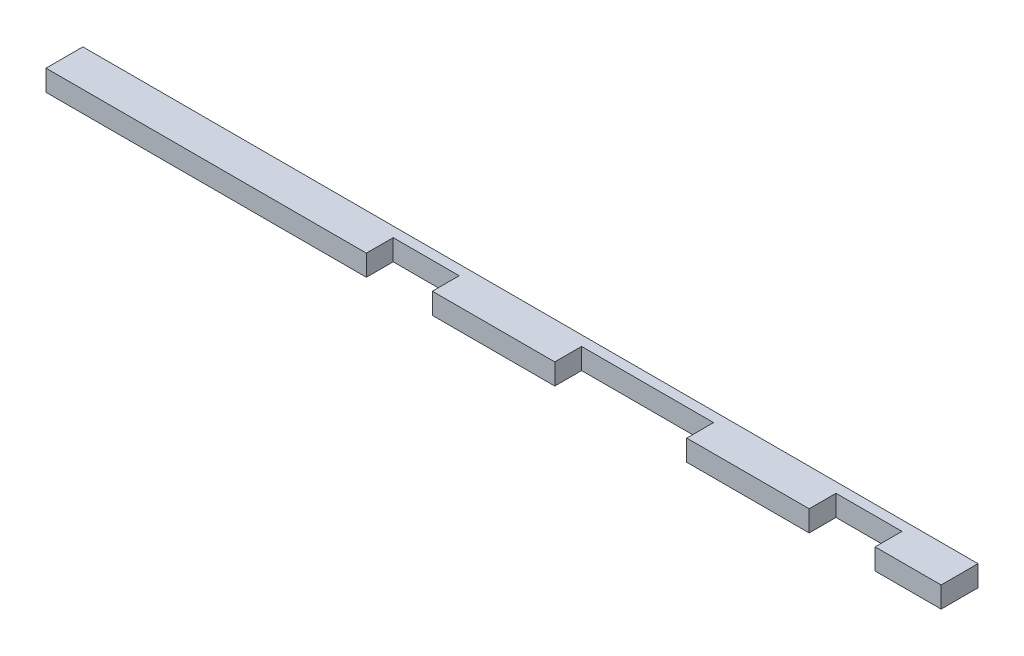
ISO-10303-21;
HEADER;
FILE_DESCRIPTION(('STEP AP214'),'2;1');
FILE_NAME('part.step','',(''),(''),'','','');
FILE_SCHEMA(('AUTOMOTIVE_DESIGN { 1 0 10303 214 1 1 1 1 }'));
ENDSEC;
DATA;
#1=APPLICATION_CONTEXT('core data for automotive mechanical design processes');
#2=APPLICATION_PROTOCOL_DEFINITION('international standard','automotive_design',2000,#1);
#3=PRODUCT_CONTEXT('',#1,'mechanical');
#4=PRODUCT('Part','Part','',(#3));
#5=PRODUCT_RELATED_PRODUCT_CATEGORY('part','',(#4));
#6=PRODUCT_DEFINITION_FORMATION('','',#4);
#7=PRODUCT_DEFINITION_CONTEXT('part definition',#1,'design');
#8=PRODUCT_DEFINITION('design','',#6,#7);
#9=PRODUCT_DEFINITION_SHAPE('','',#8);
#10=(LENGTH_UNIT() NAMED_UNIT(*) SI_UNIT(.MILLI.,.METRE.));
#11=(NAMED_UNIT(*) PLANE_ANGLE_UNIT() SI_UNIT($,.RADIAN.));
#12=(NAMED_UNIT(*) SI_UNIT($,.STERADIAN.) SOLID_ANGLE_UNIT());
#13=UNCERTAINTY_MEASURE_WITH_UNIT(LENGTH_MEASURE(1.E-05),#10,'distance_accuracy_value','');
#14=(GEOMETRIC_REPRESENTATION_CONTEXT(3) GLOBAL_UNCERTAINTY_ASSIGNED_CONTEXT((#13)) GLOBAL_UNIT_ASSIGNED_CONTEXT((#10,
#11,#12)) REPRESENTATION_CONTEXT('',''));
#15=CARTESIAN_POINT('',(0.,0.,0.));
#16=DIRECTION('',(0.,0.,1.));
#17=DIRECTION('',(1.,0.,0.));
#18=AXIS2_PLACEMENT_3D('',#15,#16,#17);
#19=CARTESIAN_POINT('',(0.,1.5875,-2.794));
#20=DIRECTION('',(1.,0.,0.));
#21=DIRECTION('',(0.,0.,-1.));
#22=AXIS2_PLACEMENT_3D('',#19,#20,#21);
#23=PLANE('',#22);
#24=DIRECTION('',(0.,0.,1.));
#25=VECTOR('',#24,1.);
#26=CARTESIAN_POINT('',(0.,0.,-2.794));
#27=LINE('',#26,#25);
#28=CARTESIAN_POINT('',(0.,0.,-2.794));
#29=VERTEX_POINT('',#28);
#30=CARTESIAN_POINT('',(0.,0.,0.));
#31=VERTEX_POINT('',#30);
#32=EDGE_CURVE('E177',#29,#31,#27,.T.);
#33=ORIENTED_EDGE('',*,*,#32,.T.);
#34=DIRECTION('',(0.,-1.,0.));
#35=VECTOR('',#34,1.);
#36=CARTESIAN_POINT('',(0.,1.5875,0.));
#37=LINE('',#36,#35);
#38=CARTESIAN_POINT('',(0.,1.5875,0.));
#39=VERTEX_POINT('',#38);
#40=EDGE_CURVE('E11',#39,#31,#37,.T.);
#41=ORIENTED_EDGE('',*,*,#40,.F.);
#42=DIRECTION('',(0.,0.,1.));
#43=VECTOR('',#42,1.);
#44=CARTESIAN_POINT('',(0.,1.5875,-2.794));
#45=LINE('',#44,#43);
#46=CARTESIAN_POINT('',(0.,1.5875,-2.794));
#47=VERTEX_POINT('',#46);
#48=EDGE_CURVE('E207',#47,#39,#45,.T.);
#49=ORIENTED_EDGE('',*,*,#48,.F.);
#50=DIRECTION('',(0.,-1.,0.));
#51=VECTOR('',#50,1.);
#52=CARTESIAN_POINT('',(0.,1.5875,-2.794));
#53=LINE('',#52,#51);
#54=EDGE_CURVE('E173',#47,#29,#53,.T.);
#55=ORIENTED_EDGE('',*,*,#54,.T.);
#56=EDGE_LOOP('',(#33,#41,#49,#55));
#57=FACE_BOUND('',#56,.T.);
#58=ADVANCED_FACE('F33',(#57),#23,.F.);
#59=CARTESIAN_POINT('',(0.,1.5875,0.));
#60=DIRECTION('',(0.,0.,-1.));
#61=DIRECTION('',(-1.,0.,0.));
#62=AXIS2_PLACEMENT_3D('',#59,#60,#61);
#63=PLANE('',#62);
#64=DIRECTION('',(1.,0.,0.));
#65=VECTOR('',#64,1.);
#66=CARTESIAN_POINT('',(0.,0.,0.));
#67=LINE('',#66,#65);
#68=CARTESIAN_POINT('',(24.27563042,0.,0.));
#69=VERTEX_POINT('',#68);
#70=EDGE_CURVE('E180',#31,#69,#67,.T.);
#71=ORIENTED_EDGE('',*,*,#70,.T.);
#72=DIRECTION('',(0.,-1.,0.));
#73=VECTOR('',#72,1.);
#74=CARTESIAN_POINT('',(24.27563042,1.5875,0.));
#75=LINE('',#74,#73);
#76=CARTESIAN_POINT('',(24.27563042,1.5875,0.));
#77=VERTEX_POINT('',#76);
#78=EDGE_CURVE('E41',#77,#69,#75,.T.);
#79=ORIENTED_EDGE('',*,*,#78,.F.);
#80=DIRECTION('',(1.,0.,0.));
#81=VECTOR('',#80,1.);
#82=CARTESIAN_POINT('',(0.,1.5875,0.));
#83=LINE('',#82,#81);
#84=EDGE_CURVE('E116',#39,#77,#83,.T.);
#85=ORIENTED_EDGE('',*,*,#84,.F.);
#86=ORIENTED_EDGE('',*,*,#40,.T.);
#87=EDGE_LOOP('',(#71,#79,#85,#86));
#88=FACE_BOUND('',#87,.T.);
#89=ADVANCED_FACE('F305',(#88),#63,.F.);
#90=CARTESIAN_POINT('',(24.27563042,1.5875,-2.032));
#91=DIRECTION('',(-1.,0.,0.));
#92=DIRECTION('',(0.,0.,1.));
#93=AXIS2_PLACEMENT_3D('',#90,#91,#92);
#94=PLANE('',#93);
#95=DIRECTION('',(0.,0.,-1.));
#96=VECTOR('',#95,1.);
#97=CARTESIAN_POINT('',(24.27563042,0.,-2.032));
#98=LINE('',#97,#96);
#99=CARTESIAN_POINT('',(24.27563042,0.,-2.032));
#100=VERTEX_POINT('',#99);
#101=EDGE_CURVE('E182',#69,#100,#98,.T.);
#102=ORIENTED_EDGE('',*,*,#101,.T.);
#103=DIRECTION('',(0.,-1.,0.));
#104=VECTOR('',#103,1.);
#105=CARTESIAN_POINT('',(24.27563042,1.5875,-2.032));
#106=LINE('',#105,#104);
#107=CARTESIAN_POINT('',(24.27563042,1.5875,-2.032));
#108=VERTEX_POINT('',#107);
#109=EDGE_CURVE('E238',#108,#100,#106,.T.);
#110=ORIENTED_EDGE('',*,*,#109,.F.);
#111=DIRECTION('',(0.,0.,-1.));
#112=VECTOR('',#111,1.);
#113=CARTESIAN_POINT('',(24.27563042,1.5875,-2.032));
#114=LINE('',#113,#112);
#115=EDGE_CURVE('E246',#77,#108,#114,.T.);
#116=ORIENTED_EDGE('',*,*,#115,.F.);
#117=ORIENTED_EDGE('',*,*,#78,.T.);
#118=EDGE_LOOP('',(#102,#110,#116,#117));
#119=FACE_BOUND('',#118,.T.);
#120=ADVANCED_FACE('F244',(#119),#94,.F.);
#121=CARTESIAN_POINT('',(24.27563042,1.5875,-2.032));
#122=DIRECTION('',(0.,0.,-1.));
#123=DIRECTION('',(-1.,0.,0.));
#124=AXIS2_PLACEMENT_3D('',#121,#122,#123);
#125=PLANE('',#124);
#126=DIRECTION('',(1.,0.,0.));
#127=VECTOR('',#126,1.);
#128=CARTESIAN_POINT('',(24.27563042,0.,-2.032));
#129=LINE('',#128,#127);
#130=CARTESIAN_POINT('',(29.27563042,0.,-2.032));
#131=VERTEX_POINT('',#130);
#132=EDGE_CURVE('E184',#100,#131,#129,.T.);
#133=ORIENTED_EDGE('',*,*,#132,.T.);
#134=DIRECTION('',(0.,-1.,0.));
#135=VECTOR('',#134,1.);
#136=CARTESIAN_POINT('',(29.27563042,1.5875,-2.032));
#137=LINE('',#136,#135);
#138=CARTESIAN_POINT('',(29.27563042,1.5875,-2.032));
#139=VERTEX_POINT('',#138);
#140=EDGE_CURVE('E235',#139,#131,#137,.T.);
#141=ORIENTED_EDGE('',*,*,#140,.F.);
#142=DIRECTION('',(1.,0.,0.));
#143=VECTOR('',#142,1.);
#144=CARTESIAN_POINT('',(24.27563042,1.5875,-2.032));
#145=LINE('',#144,#143);
#146=EDGE_CURVE('E264',#108,#139,#145,.T.);
#147=ORIENTED_EDGE('',*,*,#146,.F.);
#148=ORIENTED_EDGE('',*,*,#109,.T.);
#149=EDGE_LOOP('',(#133,#141,#147,#148));
#150=FACE_BOUND('',#149,.T.);
#151=ADVANCED_FACE('F255',(#150),#125,.F.);
#152=CARTESIAN_POINT('',(29.27563042,1.5875,-2.032));
#153=DIRECTION('',(1.,0.,0.));
#154=DIRECTION('',(0.,0.,-1.));
#155=AXIS2_PLACEMENT_3D('',#152,#153,#154);
#156=PLANE('',#155);
#157=DIRECTION('',(0.,0.,1.));
#158=VECTOR('',#157,1.);
#159=CARTESIAN_POINT('',(29.27563042,0.,-2.032));
#160=LINE('',#159,#158);
#161=CARTESIAN_POINT('',(29.27563042,0.,0.));
#162=VERTEX_POINT('',#161);
#163=EDGE_CURVE('E186',#131,#162,#160,.T.);
#164=ORIENTED_EDGE('',*,*,#163,.T.);
#165=DIRECTION('',(0.,-1.,0.));
#166=VECTOR('',#165,1.);
#167=CARTESIAN_POINT('',(29.27563042,1.5875,0.));
#168=LINE('',#167,#166);
#169=CARTESIAN_POINT('',(29.27563042,1.5875,0.));
#170=VERTEX_POINT('',#169);
#171=EDGE_CURVE('E232',#170,#162,#168,.T.);
#172=ORIENTED_EDGE('',*,*,#171,.F.);
#173=DIRECTION('',(0.,0.,1.));
#174=VECTOR('',#173,1.);
#175=CARTESIAN_POINT('',(29.27563042,1.5875,-2.032));
#176=LINE('',#175,#174);
#177=EDGE_CURVE('E261',#139,#170,#176,.T.);
#178=ORIENTED_EDGE('',*,*,#177,.F.);
#179=ORIENTED_EDGE('',*,*,#140,.T.);
#180=EDGE_LOOP('',(#164,#172,#178,#179));
#181=FACE_BOUND('',#180,.T.);
#182=ADVANCED_FACE('F259',(#181),#156,.F.);
#183=CARTESIAN_POINT('',(29.27563042,1.5875,0.));
#184=DIRECTION('',(0.,0.,-1.));
#185=DIRECTION('',(-1.,0.,0.));
#186=AXIS2_PLACEMENT_3D('',#183,#184,#185);
#187=PLANE('',#186);
#188=DIRECTION('',(1.,0.,0.));
#189=VECTOR('',#188,1.);
#190=CARTESIAN_POINT('',(29.27563042,0.,0.));
#191=LINE('',#190,#189);
#192=CARTESIAN_POINT('',(38.55125958,0.,0.));
#193=VERTEX_POINT('',#192);
#194=EDGE_CURVE('E188',#162,#193,#191,.T.);
#195=ORIENTED_EDGE('',*,*,#194,.T.);
#196=DIRECTION('',(0.,-1.,0.));
#197=VECTOR('',#196,1.);
#198=CARTESIAN_POINT('',(38.55125958,1.5875,0.));
#199=LINE('',#198,#197);
#200=CARTESIAN_POINT('',(38.55125958,1.5875,0.));
#201=VERTEX_POINT('',#200);
#202=EDGE_CURVE('E229',#201,#193,#199,.T.);
#203=ORIENTED_EDGE('',*,*,#202,.F.);
#204=DIRECTION('',(1.,0.,0.));
#205=VECTOR('',#204,1.);
#206=CARTESIAN_POINT('',(29.27563042,1.5875,0.));
#207=LINE('',#206,#205);
#208=EDGE_CURVE('E263',#170,#201,#207,.T.);
#209=ORIENTED_EDGE('',*,*,#208,.F.);
#210=ORIENTED_EDGE('',*,*,#171,.T.);
#211=EDGE_LOOP('',(#195,#203,#209,#210));
#212=FACE_BOUND('',#211,.T.);
#213=ADVANCED_FACE('F318',(#212),#187,.F.);
#214=CARTESIAN_POINT('',(38.55125958,1.5875,-2.032));
#215=DIRECTION('',(-1.,0.,0.));
#216=DIRECTION('',(0.,0.,1.));
#217=AXIS2_PLACEMENT_3D('',#214,#215,#216);
#218=PLANE('',#217);
#219=DIRECTION('',(0.,0.,-1.));
#220=VECTOR('',#219,1.);
#221=CARTESIAN_POINT('',(38.55125958,0.,-2.032));
#222=LINE('',#221,#220);
#223=CARTESIAN_POINT('',(38.55125958,0.,-2.032));
#224=VERTEX_POINT('',#223);
#225=EDGE_CURVE('E190',#193,#224,#222,.T.);
#226=ORIENTED_EDGE('',*,*,#225,.T.);
#227=DIRECTION('',(0.,-1.,0.));
#228=VECTOR('',#227,1.);
#229=CARTESIAN_POINT('',(38.55125958,1.5875,-2.032));
#230=LINE('',#229,#228);
#231=CARTESIAN_POINT('',(38.55125958,1.5875,-2.032));
#232=VERTEX_POINT('',#231);
#233=EDGE_CURVE('E226',#232,#224,#230,.T.);
#234=ORIENTED_EDGE('',*,*,#233,.F.);
#235=DIRECTION('',(0.,0.,-1.));
#236=VECTOR('',#235,1.);
#237=CARTESIAN_POINT('',(38.55125958,1.5875,-2.032));
#238=LINE('',#237,#236);
#239=EDGE_CURVE('E266',#201,#232,#238,.T.);
#240=ORIENTED_EDGE('',*,*,#239,.F.);
#241=ORIENTED_EDGE('',*,*,#202,.T.);
#242=EDGE_LOOP('',(#226,#234,#240,#241));
#243=FACE_BOUND('',#242,.T.);
#244=ADVANCED_FACE('F321',(#243),#218,.F.);
#245=CARTESIAN_POINT('',(38.55125958,1.5875,-2.032));
#246=DIRECTION('',(0.,0.,-1.));
#247=DIRECTION('',(-1.,0.,0.));
#248=AXIS2_PLACEMENT_3D('',#245,#246,#247);
#249=PLANE('',#248);
#250=DIRECTION('',(1.,0.,0.));
#251=VECTOR('',#250,1.);
#252=CARTESIAN_POINT('',(38.55125958,0.,-2.032));
#253=LINE('',#252,#251);
#254=CARTESIAN_POINT('',(48.55125958,0.,-2.032));
#255=VERTEX_POINT('',#254);
#256=EDGE_CURVE('E192',#224,#255,#253,.T.);
#257=ORIENTED_EDGE('',*,*,#256,.T.);
#258=DIRECTION('',(0.,-1.,0.));
#259=VECTOR('',#258,1.);
#260=CARTESIAN_POINT('',(48.55125958,1.5875,-2.032));
#261=LINE('',#260,#259);
#262=CARTESIAN_POINT('',(48.55125958,1.5875,-2.032));
#263=VERTEX_POINT('',#262);
#264=EDGE_CURVE('E223',#263,#255,#261,.T.);
#265=ORIENTED_EDGE('',*,*,#264,.F.);
#266=DIRECTION('',(1.,0.,0.));
#267=VECTOR('',#266,1.);
#268=CARTESIAN_POINT('',(38.55125958,1.5875,-2.032));
#269=LINE('',#268,#267);
#270=EDGE_CURVE('E272',#232,#263,#269,.T.);
#271=ORIENTED_EDGE('',*,*,#270,.F.);
#272=ORIENTED_EDGE('',*,*,#233,.T.);
#273=EDGE_LOOP('',(#257,#265,#271,#272));
#274=FACE_BOUND('',#273,.T.);
#275=ADVANCED_FACE('F325',(#274),#249,.F.);
#276=CARTESIAN_POINT('',(48.55125958,1.5875,-2.032));
#277=DIRECTION('',(1.,0.,0.));
#278=DIRECTION('',(0.,0.,-1.));
#279=AXIS2_PLACEMENT_3D('',#276,#277,#278);
#280=PLANE('',#279);
#281=DIRECTION('',(0.,0.,1.));
#282=VECTOR('',#281,1.);
#283=CARTESIAN_POINT('',(48.55125958,0.,-2.032));
#284=LINE('',#283,#282);
#285=CARTESIAN_POINT('',(48.55125958,0.,0.));
#286=VERTEX_POINT('',#285);
#287=EDGE_CURVE('E194',#255,#286,#284,.T.);
#288=ORIENTED_EDGE('',*,*,#287,.T.);
#289=DIRECTION('',(0.,-1.,0.));
#290=VECTOR('',#289,1.);
#291=CARTESIAN_POINT('',(48.55125958,1.5875,0.));
#292=LINE('',#291,#290);
#293=CARTESIAN_POINT('',(48.55125958,1.5875,0.));
#294=VERTEX_POINT('',#293);
#295=EDGE_CURVE('E220',#294,#286,#292,.T.);
#296=ORIENTED_EDGE('',*,*,#295,.F.);
#297=DIRECTION('',(0.,0.,1.));
#298=VECTOR('',#297,1.);
#299=CARTESIAN_POINT('',(48.55125958,1.5875,-2.032));
#300=LINE('',#299,#298);
#301=EDGE_CURVE('E274',#263,#294,#300,.T.);
#302=ORIENTED_EDGE('',*,*,#301,.F.);
#303=ORIENTED_EDGE('',*,*,#264,.T.);
#304=EDGE_LOOP('',(#288,#296,#302,#303));
#305=FACE_BOUND('',#304,.T.);
#306=ADVANCED_FACE('F329',(#305),#280,.F.);
#307=CARTESIAN_POINT('',(48.55125958,1.5875,0.));
#308=DIRECTION('',(0.,0.,-1.));
#309=DIRECTION('',(-1.,0.,0.));
#310=AXIS2_PLACEMENT_3D('',#307,#308,#309);
#311=PLANE('',#310);
#312=DIRECTION('',(1.,0.,0.));
#313=VECTOR('',#312,1.);
#314=CARTESIAN_POINT('',(48.55125958,0.,0.));
#315=LINE('',#314,#313);
#316=CARTESIAN_POINT('',(57.82689,0.,0.));
#317=VERTEX_POINT('',#316);
#318=EDGE_CURVE('E196',#286,#317,#315,.T.);
#319=ORIENTED_EDGE('',*,*,#318,.T.);
#320=DIRECTION('',(0.,-1.,0.));
#321=VECTOR('',#320,1.);
#322=CARTESIAN_POINT('',(57.82689,1.5875,0.));
#323=LINE('',#322,#321);
#324=CARTESIAN_POINT('',(57.82689,1.5875,0.));
#325=VERTEX_POINT('',#324);
#326=EDGE_CURVE('E217',#325,#317,#323,.T.);
#327=ORIENTED_EDGE('',*,*,#326,.F.);
#328=DIRECTION('',(1.,0.,0.));
#329=VECTOR('',#328,1.);
#330=CARTESIAN_POINT('',(48.55125958,1.5875,0.));
#331=LINE('',#330,#329);
#332=EDGE_CURVE('E276',#294,#325,#331,.T.);
#333=ORIENTED_EDGE('',*,*,#332,.F.);
#334=ORIENTED_EDGE('',*,*,#295,.T.);
#335=EDGE_LOOP('',(#319,#327,#333,#334));
#336=FACE_BOUND('',#335,.T.);
#337=ADVANCED_FACE('F333',(#336),#311,.F.);
#338=CARTESIAN_POINT('',(57.82689,1.5875,-2.032));
#339=DIRECTION('',(-1.,0.,0.));
#340=DIRECTION('',(0.,0.,1.));
#341=AXIS2_PLACEMENT_3D('',#338,#339,#340);
#342=PLANE('',#341);
#343=DIRECTION('',(0.,0.,-1.));
#344=VECTOR('',#343,1.);
#345=CARTESIAN_POINT('',(57.82689,0.,-2.032));
#346=LINE('',#345,#344);
#347=CARTESIAN_POINT('',(57.82689,0.,-2.032));
#348=VERTEX_POINT('',#347);
#349=EDGE_CURVE('E198',#317,#348,#346,.T.);
#350=ORIENTED_EDGE('',*,*,#349,.T.);
#351=DIRECTION('',(0.,-1.,0.));
#352=VECTOR('',#351,1.);
#353=CARTESIAN_POINT('',(57.82689,1.5875,-2.032));
#354=LINE('',#353,#352);
#355=CARTESIAN_POINT('',(57.82689,1.5875,-2.032));
#356=VERTEX_POINT('',#355);
#357=EDGE_CURVE('E214',#356,#348,#354,.T.);
#358=ORIENTED_EDGE('',*,*,#357,.F.);
#359=DIRECTION('',(0.,0.,-1.));
#360=VECTOR('',#359,1.);
#361=CARTESIAN_POINT('',(57.82689,1.5875,-2.032));
#362=LINE('',#361,#360);
#363=EDGE_CURVE('E278',#325,#356,#362,.T.);
#364=ORIENTED_EDGE('',*,*,#363,.F.);
#365=ORIENTED_EDGE('',*,*,#326,.T.);
#366=EDGE_LOOP('',(#350,#358,#364,#365));
#367=FACE_BOUND('',#366,.T.);
#368=ADVANCED_FACE('F337',(#367),#342,.F.);
#369=CARTESIAN_POINT('',(57.82689,1.5875,-2.032));
#370=DIRECTION('',(0.,0.,-1.));
#371=DIRECTION('',(-1.,0.,0.));
#372=AXIS2_PLACEMENT_3D('',#369,#370,#371);
#373=PLANE('',#372);
#374=DIRECTION('',(1.,0.,0.));
#375=VECTOR('',#374,1.);
#376=CARTESIAN_POINT('',(57.82689,0.,-2.032));
#377=LINE('',#376,#375);
#378=CARTESIAN_POINT('',(62.82689,0.,-2.032));
#379=VERTEX_POINT('',#378);
#380=EDGE_CURVE('E200',#348,#379,#377,.T.);
#381=ORIENTED_EDGE('',*,*,#380,.T.);
#382=DIRECTION('',(0.,-1.,0.));
#383=VECTOR('',#382,1.);
#384=CARTESIAN_POINT('',(62.82689,1.5875,-2.032));
#385=LINE('',#384,#383);
#386=CARTESIAN_POINT('',(62.82689,1.5875,-2.032));
#387=VERTEX_POINT('',#386);
#388=EDGE_CURVE('E211',#387,#379,#385,.T.);
#389=ORIENTED_EDGE('',*,*,#388,.F.);
#390=DIRECTION('',(1.,0.,0.));
#391=VECTOR('',#390,1.);
#392=CARTESIAN_POINT('',(57.82689,1.5875,-2.032));
#393=LINE('',#392,#391);
#394=EDGE_CURVE('E280',#356,#387,#393,.T.);
#395=ORIENTED_EDGE('',*,*,#394,.F.);
#396=ORIENTED_EDGE('',*,*,#357,.T.);
#397=EDGE_LOOP('',(#381,#389,#395,#396));
#398=FACE_BOUND('',#397,.T.);
#399=ADVANCED_FACE('F286',(#398),#373,.F.);
#400=CARTESIAN_POINT('',(62.82689,1.5875,0.));
#401=DIRECTION('',(1.,0.,0.));
#402=DIRECTION('',(0.,0.,-1.));
#403=AXIS2_PLACEMENT_3D('',#400,#401,#402);
#404=PLANE('',#403);
#405=DIRECTION('',(0.,0.,1.));
#406=VECTOR('',#405,1.);
#407=CARTESIAN_POINT('',(62.82689,0.,0.));
#408=LINE('',#407,#406);
#409=CARTESIAN_POINT('',(62.82689,0.,0.));
#410=VERTEX_POINT('',#409);
#411=EDGE_CURVE('E202',#379,#410,#408,.T.);
#412=ORIENTED_EDGE('',*,*,#411,.T.);
#413=DIRECTION('',(0.,-1.,0.));
#414=VECTOR('',#413,1.);
#415=CARTESIAN_POINT('',(62.82689,1.5875,0.));
#416=LINE('',#415,#414);
#417=CARTESIAN_POINT('',(62.82689,1.5875,0.));
#418=VERTEX_POINT('',#417);
#419=EDGE_CURVE('E168',#418,#410,#416,.T.);
#420=ORIENTED_EDGE('',*,*,#419,.F.);
#421=DIRECTION('',(0.,0.,1.));
#422=VECTOR('',#421,1.);
#423=CARTESIAN_POINT('',(62.82689,1.5875,0.));
#424=LINE('',#423,#422);
#425=EDGE_CURVE('E159',#387,#418,#424,.T.);
#426=ORIENTED_EDGE('',*,*,#425,.F.);
#427=ORIENTED_EDGE('',*,*,#388,.T.);
#428=EDGE_LOOP('',(#412,#420,#426,#427));
#429=FACE_BOUND('',#428,.T.);
#430=ADVANCED_FACE('F290',(#429),#404,.F.);
#431=CARTESIAN_POINT('',(62.82689,1.5875,0.));
#432=DIRECTION('',(0.,0.,-1.));
#433=DIRECTION('',(-1.,0.,0.));
#434=AXIS2_PLACEMENT_3D('',#431,#432,#433);
#435=PLANE('',#434);
#436=DIRECTION('',(1.,0.,0.));
#437=VECTOR('',#436,1.);
#438=CARTESIAN_POINT('',(62.82689,0.,0.));
#439=LINE('',#438,#437);
#440=CARTESIAN_POINT('',(67.82689,0.,0.));
#441=VERTEX_POINT('',#440);
#442=EDGE_CURVE('E167',#410,#441,#439,.T.);
#443=ORIENTED_EDGE('',*,*,#442,.T.);
#444=DIRECTION('',(0.,-1.,0.));
#445=VECTOR('',#444,1.);
#446=CARTESIAN_POINT('',(67.82689,1.5875,0.));
#447=LINE('',#446,#445);
#448=CARTESIAN_POINT('',(67.82689,1.5875,0.));
#449=VERTEX_POINT('',#448);
#450=EDGE_CURVE('E164',#449,#441,#447,.T.);
#451=ORIENTED_EDGE('',*,*,#450,.F.);
#452=DIRECTION('',(1.,0.,0.));
#453=VECTOR('',#452,1.);
#454=CARTESIAN_POINT('',(62.82689,1.5875,0.));
#455=LINE('',#454,#453);
#456=EDGE_CURVE('E153',#418,#449,#455,.T.);
#457=ORIENTED_EDGE('',*,*,#456,.F.);
#458=ORIENTED_EDGE('',*,*,#419,.T.);
#459=EDGE_LOOP('',(#443,#451,#457,#458));
#460=FACE_BOUND('',#459,.T.);
#461=ADVANCED_FACE('F165',(#460),#435,.F.);
#462=CARTESIAN_POINT('',(67.82689,1.5875,-2.794));
#463=DIRECTION('',(-1.,0.,0.));
#464=DIRECTION('',(0.,0.,1.));
#465=AXIS2_PLACEMENT_3D('',#462,#463,#464);
#466=PLANE('',#465);
#467=DIRECTION('',(0.,0.,-1.));
#468=VECTOR('',#467,1.);
#469=CARTESIAN_POINT('',(67.82689,0.,-2.794));
#470=LINE('',#469,#468);
#471=CARTESIAN_POINT('',(67.82689,0.,-2.794));
#472=VERTEX_POINT('',#471);
#473=EDGE_CURVE('E102',#441,#472,#470,.T.);
#474=ORIENTED_EDGE('',*,*,#473,.T.);
#475=DIRECTION('',(0.,-1.,0.));
#476=VECTOR('',#475,1.);
#477=CARTESIAN_POINT('',(67.82689,1.5875,-2.794));
#478=LINE('',#477,#476);
#479=CARTESIAN_POINT('',(67.82689,1.5875,-2.794));
#480=VERTEX_POINT('',#479);
#481=EDGE_CURVE('E169',#480,#472,#478,.T.);
#482=ORIENTED_EDGE('',*,*,#481,.F.);
#483=DIRECTION('',(0.,0.,-1.));
#484=VECTOR('',#483,1.);
#485=CARTESIAN_POINT('',(67.82689,1.5875,-2.794));
#486=LINE('',#485,#484);
#487=EDGE_CURVE('E157',#449,#480,#486,.T.);
#488=ORIENTED_EDGE('',*,*,#487,.F.);
#489=ORIENTED_EDGE('',*,*,#450,.T.);
#490=EDGE_LOOP('',(#474,#482,#488,#489));
#491=FACE_BOUND('',#490,.T.);
#492=ADVANCED_FACE('F171',(#491),#466,.F.);
#493=CARTESIAN_POINT('',(0.,1.5875,-2.794));
#494=DIRECTION('',(0.,0.,1.));
#495=DIRECTION('',(1.,0.,0.));
#496=AXIS2_PLACEMENT_3D('',#493,#494,#495);
#497=PLANE('',#496);
#498=DIRECTION('',(-1.,0.,0.));
#499=VECTOR('',#498,1.);
#500=CARTESIAN_POINT('',(0.,0.,-2.794));
#501=LINE('',#500,#499);
#502=EDGE_CURVE('E108',#472,#29,#501,.T.);
#503=ORIENTED_EDGE('',*,*,#502,.T.);
#504=ORIENTED_EDGE('',*,*,#54,.F.);
#505=DIRECTION('',(-1.,0.,0.));
#506=VECTOR('',#505,1.);
#507=CARTESIAN_POINT('',(0.,1.5875,-2.794));
#508=LINE('',#507,#506);
#509=EDGE_CURVE('E49',#480,#47,#508,.T.);
#510=ORIENTED_EDGE('',*,*,#509,.F.);
#511=ORIENTED_EDGE('',*,*,#481,.T.);
#512=EDGE_LOOP('',(#503,#504,#510,#511));
#513=FACE_BOUND('',#512,.T.);
#514=ADVANCED_FACE('F294',(#513),#497,.F.);
#515=CARTESIAN_POINT('',(0.,1.5875,0.));
#516=DIRECTION('',(0.,1.,0.));
#517=DIRECTION('',(0.,0.,1.));
#518=AXIS2_PLACEMENT_3D('',#515,#516,#517);
#519=PLANE('',#518);
#520=ORIENTED_EDGE('',*,*,#48,.T.);
#521=ORIENTED_EDGE('',*,*,#84,.T.);
#522=ORIENTED_EDGE('',*,*,#115,.T.);
#523=ORIENTED_EDGE('',*,*,#146,.T.);
#524=ORIENTED_EDGE('',*,*,#177,.T.);
#525=ORIENTED_EDGE('',*,*,#208,.T.);
#526=ORIENTED_EDGE('',*,*,#239,.T.);
#527=ORIENTED_EDGE('',*,*,#270,.T.);
#528=ORIENTED_EDGE('',*,*,#301,.T.);
#529=ORIENTED_EDGE('',*,*,#332,.T.);
#530=ORIENTED_EDGE('',*,*,#363,.T.);
#531=ORIENTED_EDGE('',*,*,#394,.T.);
#532=ORIENTED_EDGE('',*,*,#425,.T.);
#533=ORIENTED_EDGE('',*,*,#456,.T.);
#534=ORIENTED_EDGE('',*,*,#487,.T.);
#535=ORIENTED_EDGE('',*,*,#509,.T.);
#536=EDGE_LOOP('',(#520,#521,#522,#523,#524,#525,#526,#527,#528,#529,#530,#531,#532,#533,#534,#535));
#537=FACE_BOUND('',#536,.T.);
#538=ADVANCED_FACE('F155',(#537),#519,.T.);
#539=CARTESIAN_POINT('',(0.,0.,0.));
#540=DIRECTION('',(0.,1.,0.));
#541=DIRECTION('',(0.,0.,1.));
#542=AXIS2_PLACEMENT_3D('',#539,#540,#541);
#543=PLANE('',#542);
#544=ORIENTED_EDGE('',*,*,#32,.F.);
#545=ORIENTED_EDGE('',*,*,#502,.F.);
#546=ORIENTED_EDGE('',*,*,#473,.F.);
#547=ORIENTED_EDGE('',*,*,#442,.F.);
#548=ORIENTED_EDGE('',*,*,#411,.F.);
#549=ORIENTED_EDGE('',*,*,#380,.F.);
#550=ORIENTED_EDGE('',*,*,#349,.F.);
#551=ORIENTED_EDGE('',*,*,#318,.F.);
#552=ORIENTED_EDGE('',*,*,#287,.F.);
#553=ORIENTED_EDGE('',*,*,#256,.F.);
#554=ORIENTED_EDGE('',*,*,#225,.F.);
#555=ORIENTED_EDGE('',*,*,#194,.F.);
#556=ORIENTED_EDGE('',*,*,#163,.F.);
#557=ORIENTED_EDGE('',*,*,#132,.F.);
#558=ORIENTED_EDGE('',*,*,#101,.F.);
#559=ORIENTED_EDGE('',*,*,#70,.F.);
#560=EDGE_LOOP('',(#544,#545,#546,#547,#548,#549,#550,#551,#552,#553,#554,#555,#556,#557,#558,#559));
#561=FACE_BOUND('',#560,.T.);
#562=ADVANCED_FACE('F250',(#561),#543,.F.);
#563=CLOSED_SHELL('',(#58,#89,#120,#151,#182,#213,#244,#275,#306,#337,#368,#399,#430,#461,#492,
#514,#538,#562));
#564=MANIFOLD_SOLID_BREP('B2',#563);
#565=ADVANCED_BREP_SHAPE_REPRESENTATION('',(#18,#564),#14);
#566=SHAPE_DEFINITION_REPRESENTATION(#9,#565);
ENDSEC;
END-ISO-10303-21;
